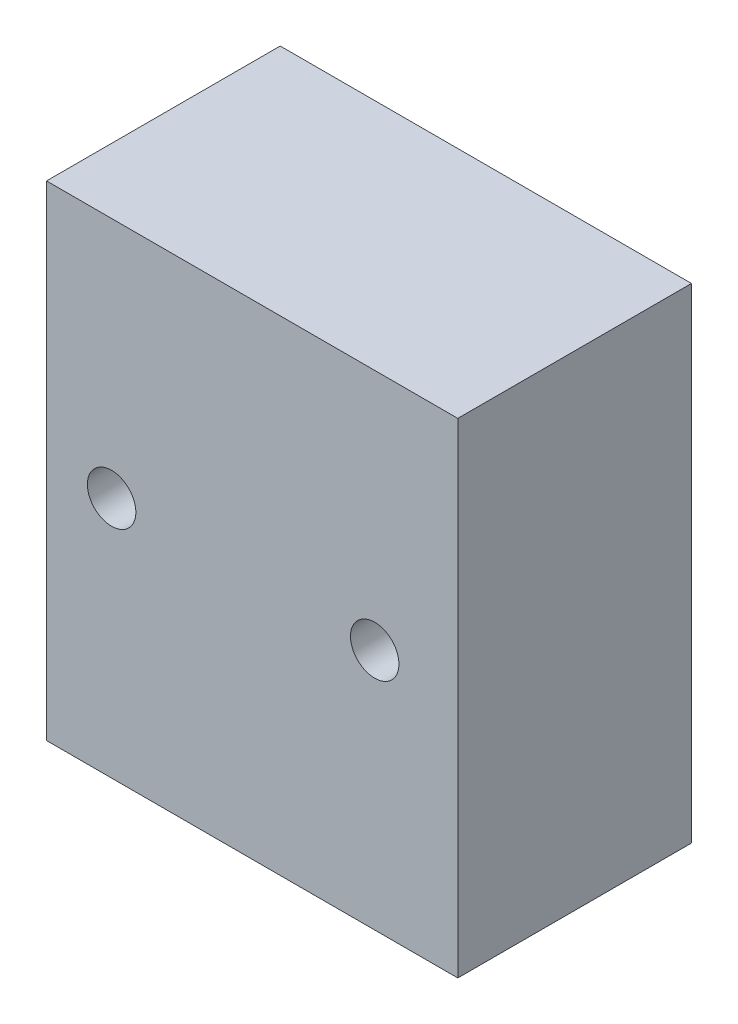
ISO-10303-21;
HEADER;
FILE_DESCRIPTION(('STEP AP214'),'2;1');
FILE_NAME('part.step','',(''),(''),'','','');
FILE_SCHEMA(('AUTOMOTIVE_DESIGN { 1 0 10303 214 1 1 1 1 }'));
ENDSEC;
DATA;
#1=APPLICATION_CONTEXT('core data for automotive mechanical design processes');
#2=APPLICATION_PROTOCOL_DEFINITION('international standard','automotive_design',2000,#1);
#3=PRODUCT_CONTEXT('',#1,'mechanical');
#4=PRODUCT('Part','Part','',(#3));
#5=PRODUCT_RELATED_PRODUCT_CATEGORY('part','',(#4));
#6=PRODUCT_DEFINITION_FORMATION('','',#4);
#7=PRODUCT_DEFINITION_CONTEXT('part definition',#1,'design');
#8=PRODUCT_DEFINITION('design','',#6,#7);
#9=PRODUCT_DEFINITION_SHAPE('','',#8);
#10=(LENGTH_UNIT() NAMED_UNIT(*) SI_UNIT(.MILLI.,.METRE.));
#11=(NAMED_UNIT(*) PLANE_ANGLE_UNIT() SI_UNIT($,.RADIAN.));
#12=(NAMED_UNIT(*) SI_UNIT($,.STERADIAN.) SOLID_ANGLE_UNIT());
#13=UNCERTAINTY_MEASURE_WITH_UNIT(LENGTH_MEASURE(1.E-05),#10,'distance_accuracy_value','');
#14=(GEOMETRIC_REPRESENTATION_CONTEXT(3) GLOBAL_UNCERTAINTY_ASSIGNED_CONTEXT((#13)) GLOBAL_UNIT_ASSIGNED_CONTEXT((#10,
#11,#12)) REPRESENTATION_CONTEXT('',''));
#15=CARTESIAN_POINT('',(0.,0.,0.));
#16=DIRECTION('',(0.,0.,1.));
#17=DIRECTION('',(1.,0.,0.));
#18=AXIS2_PLACEMENT_3D('',#15,#16,#17);
#19=CARTESIAN_POINT('',(-14.85,17.5,16.875));
#20=DIRECTION('',(1.,0.,0.));
#21=DIRECTION('',(0.,1.,0.));
#22=AXIS2_PLACEMENT_3D('',#19,#20,#21);
#23=PLANE('',#22);
#24=DIRECTION('',(0.,-1.,0.));
#25=VECTOR('',#24,1.);
#26=CARTESIAN_POINT('',(-14.85,17.5,0.));
#27=LINE('',#26,#25);
#28=CARTESIAN_POINT('',(-14.85,17.5,0.));
#29=VERTEX_POINT('',#28);
#30=CARTESIAN_POINT('',(-14.85,-17.5,0.));
#31=VERTEX_POINT('',#30);
#32=EDGE_CURVE('E96',#29,#31,#27,.T.);
#33=ORIENTED_EDGE('',*,*,#32,.T.);
#34=DIRECTION('',(0.,0.,-1.));
#35=VECTOR('',#34,1.);
#36=CARTESIAN_POINT('',(-14.85,-17.5,16.875));
#37=LINE('',#36,#35);
#38=CARTESIAN_POINT('',(-14.85,-17.5,16.875));
#39=VERTEX_POINT('',#38);
#40=EDGE_CURVE('E11',#39,#31,#37,.T.);
#41=ORIENTED_EDGE('',*,*,#40,.F.);
#42=DIRECTION('',(0.,-1.,0.));
#43=VECTOR('',#42,1.);
#44=CARTESIAN_POINT('',(-14.85,17.5,16.875));
#45=LINE('',#44,#43);
#46=CARTESIAN_POINT('',(-14.85,17.5,16.875));
#47=VERTEX_POINT('',#46);
#48=EDGE_CURVE('E82',#47,#39,#45,.T.);
#49=ORIENTED_EDGE('',*,*,#48,.F.);
#50=DIRECTION('',(0.,0.,-1.));
#51=VECTOR('',#50,1.);
#52=CARTESIAN_POINT('',(-14.85,17.5,16.875));
#53=LINE('',#52,#51);
#54=EDGE_CURVE('E49',#47,#29,#53,.T.);
#55=ORIENTED_EDGE('',*,*,#54,.T.);
#56=EDGE_LOOP('',(#33,#41,#49,#55));
#57=FACE_BOUND('',#56,.T.);
#58=ADVANCED_FACE('F33',(#57),#23,.F.);
#59=CARTESIAN_POINT('',(-14.85,-17.5,16.875));
#60=DIRECTION('',(0.,1.,0.));
#61=DIRECTION('',(0.,0.,1.));
#62=AXIS2_PLACEMENT_3D('',#59,#60,#61);
#63=PLANE('',#62);
#64=DIRECTION('',(1.,0.,0.));
#65=VECTOR('',#64,1.);
#66=CARTESIAN_POINT('',(-14.85,-17.5,0.));
#67=LINE('',#66,#65);
#68=CARTESIAN_POINT('',(14.85,-17.5,0.));
#69=VERTEX_POINT('',#68);
#70=EDGE_CURVE('E87',#31,#69,#67,.T.);
#71=ORIENTED_EDGE('',*,*,#70,.T.);
#72=DIRECTION('',(0.,0.,-1.));
#73=VECTOR('',#72,1.);
#74=CARTESIAN_POINT('',(14.85,-17.5,16.875));
#75=LINE('',#74,#73);
#76=CARTESIAN_POINT('',(14.85,-17.5,16.875));
#77=VERTEX_POINT('',#76);
#78=EDGE_CURVE('E41',#77,#69,#75,.T.);
#79=ORIENTED_EDGE('',*,*,#78,.F.);
#80=DIRECTION('',(1.,0.,0.));
#81=VECTOR('',#80,1.);
#82=CARTESIAN_POINT('',(-14.85,-17.5,16.875));
#83=LINE('',#82,#81);
#84=EDGE_CURVE('E74',#39,#77,#83,.T.);
#85=ORIENTED_EDGE('',*,*,#84,.F.);
#86=ORIENTED_EDGE('',*,*,#40,.T.);
#87=EDGE_LOOP('',(#71,#79,#85,#86));
#88=FACE_BOUND('',#87,.T.);
#89=ADVANCED_FACE('F86',(#88),#63,.F.);
#90=CARTESIAN_POINT('',(14.85,17.5,16.875));
#91=DIRECTION('',(1.,0.,0.));
#92=DIRECTION('',(0.,0.,-1.));
#93=AXIS2_PLACEMENT_3D('',#90,#91,#92);
#94=PLANE('',#93);
#95=DIRECTION('',(0.,-1.,0.));
#96=VECTOR('',#95,1.);
#97=CARTESIAN_POINT('',(14.85,17.5,0.));
#98=LINE('',#97,#96);
#99=CARTESIAN_POINT('',(14.85,17.5,0.));
#100=VERTEX_POINT('',#99);
#101=EDGE_CURVE('E100',#100,#69,#98,.T.);
#102=ORIENTED_EDGE('',*,*,#101,.F.);
#103=DIRECTION('',(0.,0.,-1.));
#104=VECTOR('',#103,1.);
#105=CARTESIAN_POINT('',(14.85,17.5,16.875));
#106=LINE('',#105,#104);
#107=CARTESIAN_POINT('',(14.85,17.5,16.875));
#108=VERTEX_POINT('',#107);
#109=EDGE_CURVE('E63',#108,#100,#106,.T.);
#110=ORIENTED_EDGE('',*,*,#109,.F.);
#111=DIRECTION('',(0.,-1.,0.));
#112=VECTOR('',#111,1.);
#113=CARTESIAN_POINT('',(14.85,17.5,16.875));
#114=LINE('',#113,#112);
#115=EDGE_CURVE('E81',#108,#77,#114,.T.);
#116=ORIENTED_EDGE('',*,*,#115,.T.);
#117=ORIENTED_EDGE('',*,*,#78,.T.);
#118=EDGE_LOOP('',(#102,#110,#116,#117));
#119=FACE_BOUND('',#118,.T.);
#120=ADVANCED_FACE('F90',(#119),#94,.T.);
#121=CARTESIAN_POINT('',(-14.85,17.5,16.875));
#122=DIRECTION('',(0.,1.,0.));
#123=DIRECTION('',(0.,0.,1.));
#124=AXIS2_PLACEMENT_3D('',#121,#122,#123);
#125=PLANE('',#124);
#126=DIRECTION('',(1.,0.,0.));
#127=VECTOR('',#126,1.);
#128=CARTESIAN_POINT('',(-14.85,17.5,0.));
#129=LINE('',#128,#127);
#130=EDGE_CURVE('E102',#29,#100,#129,.T.);
#131=ORIENTED_EDGE('',*,*,#130,.F.);
#132=ORIENTED_EDGE('',*,*,#54,.F.);
#133=DIRECTION('',(1.,0.,0.));
#134=VECTOR('',#133,1.);
#135=CARTESIAN_POINT('',(-14.85,17.5,16.875));
#136=LINE('',#135,#134);
#137=EDGE_CURVE('E91',#47,#108,#136,.T.);
#138=ORIENTED_EDGE('',*,*,#137,.T.);
#139=ORIENTED_EDGE('',*,*,#109,.T.);
#140=EDGE_LOOP('',(#131,#132,#138,#139));
#141=FACE_BOUND('',#140,.T.);
#142=ADVANCED_FACE('F134',(#141),#125,.T.);
#143=CARTESIAN_POINT('',(0.,0.,16.875));
#144=DIRECTION('',(0.,0.,1.));
#145=DIRECTION('',(1.,0.,0.));
#146=AXIS2_PLACEMENT_3D('',#143,#144,#145);
#147=PLANE('',#146);
#148=CARTESIAN_POINT('',(8.85000000000078,0.,16.875));
#149=DIRECTION('',(0.,0.,-1.));
#150=DIRECTION('',(-1.,0.,0.));
#151=AXIS2_PLACEMENT_3D('',#148,#149,#150);
#152=CIRCLE('',#151,1.75);
#153=CARTESIAN_POINT('',(7.10000000000078,0.,16.875));
#154=VERTEX_POINT('',#153);
#155=EDGE_CURVE('E98',#154,#154,#152,.T.);
#156=ORIENTED_EDGE('',*,*,#155,.T.);
#157=EDGE_LOOP('',(#156));
#158=FACE_BOUND('',#157,.T.);
#159=CARTESIAN_POINT('',(-10.1499999999992,0.,16.875));
#160=DIRECTION('',(0.,0.,-1.));
#161=DIRECTION('',(-1.,0.,0.));
#162=AXIS2_PLACEMENT_3D('',#159,#160,#161);
#163=CIRCLE('',#162,1.75);
#164=CARTESIAN_POINT('',(-11.8999999999992,0.,16.875));
#165=VERTEX_POINT('',#164);
#166=EDGE_CURVE('E111',#165,#165,#163,.T.);
#167=ORIENTED_EDGE('',*,*,#166,.T.);
#168=EDGE_LOOP('',(#167));
#169=FACE_BOUND('',#168,.T.);
#170=ORIENTED_EDGE('',*,*,#48,.T.);
#171=ORIENTED_EDGE('',*,*,#84,.T.);
#172=ORIENTED_EDGE('',*,*,#115,.F.);
#173=ORIENTED_EDGE('',*,*,#137,.F.);
#174=EDGE_LOOP('',(#170,#171,#172,#173));
#175=FACE_BOUND('',#174,.T.);
#176=ADVANCED_FACE('F78',(#158,#169,#175),#147,.T.);
#177=CARTESIAN_POINT('',(0.,0.,0.));
#178=DIRECTION('',(0.,0.,1.));
#179=DIRECTION('',(1.,0.,0.));
#180=AXIS2_PLACEMENT_3D('',#177,#178,#179);
#181=PLANE('',#180);
#182=CARTESIAN_POINT('',(8.85000000000078,0.,0.));
#183=DIRECTION('',(0.,0.,-1.));
#184=DIRECTION('',(-1.,0.,0.));
#185=AXIS2_PLACEMENT_3D('',#182,#183,#184);
#186=CIRCLE('',#185,1.75);
#187=CARTESIAN_POINT('',(7.10000000000078,0.,0.));
#188=VERTEX_POINT('',#187);
#189=EDGE_CURVE('E114',#188,#188,#186,.T.);
#190=ORIENTED_EDGE('',*,*,#189,.F.);
#191=EDGE_LOOP('',(#190));
#192=FACE_BOUND('',#191,.T.);
#193=CARTESIAN_POINT('',(-10.1499999999992,0.,0.));
#194=DIRECTION('',(0.,0.,-1.));
#195=DIRECTION('',(-1.,0.,0.));
#196=AXIS2_PLACEMENT_3D('',#193,#194,#195);
#197=CIRCLE('',#196,1.75);
#198=CARTESIAN_POINT('',(-11.8999999999992,0.,0.));
#199=VERTEX_POINT('',#198);
#200=EDGE_CURVE('E108',#199,#199,#197,.T.);
#201=ORIENTED_EDGE('',*,*,#200,.F.);
#202=EDGE_LOOP('',(#201));
#203=FACE_BOUND('',#202,.T.);
#204=ORIENTED_EDGE('',*,*,#32,.F.);
#205=ORIENTED_EDGE('',*,*,#130,.T.);
#206=ORIENTED_EDGE('',*,*,#101,.T.);
#207=ORIENTED_EDGE('',*,*,#70,.F.);
#208=EDGE_LOOP('',(#204,#205,#206,#207));
#209=FACE_BOUND('',#208,.T.);
#210=ADVANCED_FACE('F129',(#192,#203,#209),#181,.F.);
#211=CARTESIAN_POINT('',(-10.1499999999992,0.,16.875));
#212=DIRECTION('',(0.,0.,-1.));
#213=DIRECTION('',(-1.,0.,0.));
#214=AXIS2_PLACEMENT_3D('',#211,#212,#213);
#215=CYLINDRICAL_SURFACE('',#214,1.75);
#216=ORIENTED_EDGE('',*,*,#166,.F.);
#217=EDGE_LOOP('',(#216));
#218=FACE_BOUND('',#217,.T.);
#219=ORIENTED_EDGE('',*,*,#200,.T.);
#220=EDGE_LOOP('',(#219));
#221=FACE_BOUND('',#220,.T.);
#222=ADVANCED_FACE('F125',(#218,#221),#215,.F.);
#223=CARTESIAN_POINT('',(8.85000000000078,0.,16.875));
#224=DIRECTION('',(0.,0.,-1.));
#225=DIRECTION('',(-1.,0.,0.));
#226=AXIS2_PLACEMENT_3D('',#223,#224,#225);
#227=CYLINDRICAL_SURFACE('',#226,1.75);
#228=ORIENTED_EDGE('',*,*,#155,.F.);
#229=EDGE_LOOP('',(#228));
#230=FACE_BOUND('',#229,.T.);
#231=ORIENTED_EDGE('',*,*,#189,.T.);
#232=EDGE_LOOP('',(#231));
#233=FACE_BOUND('',#232,.T.);
#234=ADVANCED_FACE('F122',(#230,#233),#227,.F.);
#235=CLOSED_SHELL('',(#58,#89,#120,#142,#176,#210,#222,#234));
#236=MANIFOLD_SOLID_BREP('B2',#235);
#237=ADVANCED_BREP_SHAPE_REPRESENTATION('',(#18,#236),#14);
#238=SHAPE_DEFINITION_REPRESENTATION(#9,#237);
ENDSEC;
END-ISO-10303-21;
